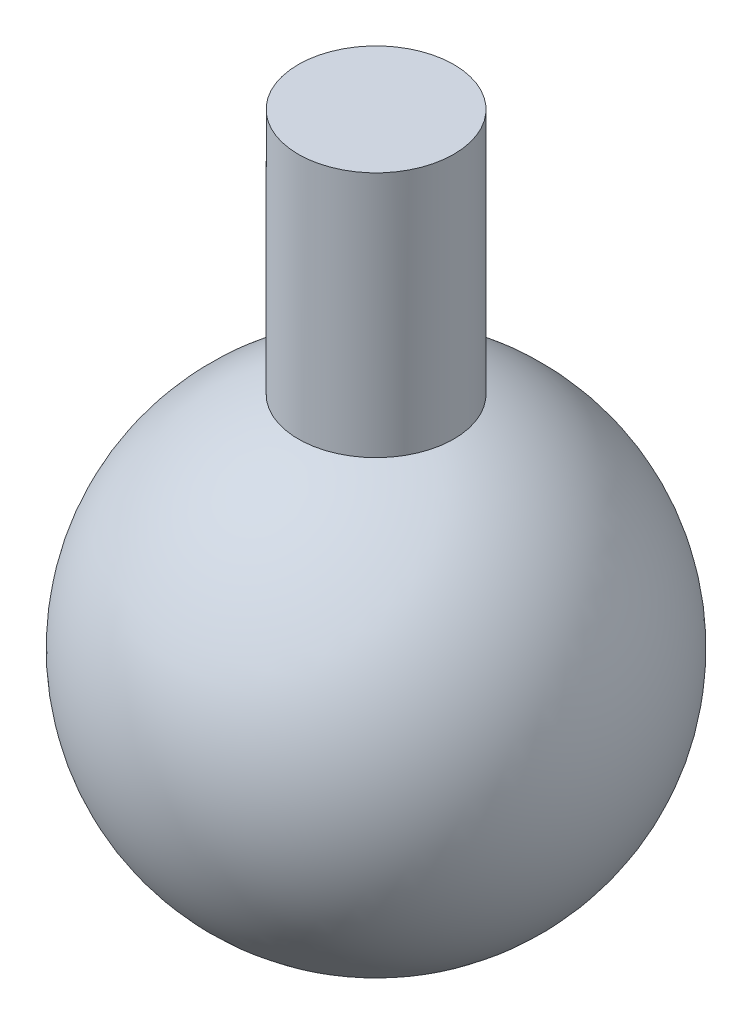
ISO-10303-21;
HEADER;
FILE_DESCRIPTION(('STEP AP214'),'2;1');
FILE_NAME('part.step','',(''),(''),'','','');
FILE_SCHEMA(('AUTOMOTIVE_DESIGN { 1 0 10303 214 1 1 1 1 }'));
ENDSEC;
DATA;
#1=APPLICATION_CONTEXT('core data for automotive mechanical design processes');
#2=APPLICATION_PROTOCOL_DEFINITION('international standard','automotive_design',2000,#1);
#3=PRODUCT_CONTEXT('',#1,'mechanical');
#4=PRODUCT('Part','Part','',(#3));
#5=PRODUCT_RELATED_PRODUCT_CATEGORY('part','',(#4));
#6=PRODUCT_DEFINITION_FORMATION('','',#4);
#7=PRODUCT_DEFINITION_CONTEXT('part definition',#1,'design');
#8=PRODUCT_DEFINITION('design','',#6,#7);
#9=PRODUCT_DEFINITION_SHAPE('','',#8);
#10=(LENGTH_UNIT() NAMED_UNIT(*) SI_UNIT(.MILLI.,.METRE.));
#11=(NAMED_UNIT(*) PLANE_ANGLE_UNIT() SI_UNIT($,.RADIAN.));
#12=(NAMED_UNIT(*) SI_UNIT($,.STERADIAN.) SOLID_ANGLE_UNIT());
#13=UNCERTAINTY_MEASURE_WITH_UNIT(LENGTH_MEASURE(1.E-05),#10,'distance_accuracy_value','');
#14=(GEOMETRIC_REPRESENTATION_CONTEXT(3) GLOBAL_UNCERTAINTY_ASSIGNED_CONTEXT((#13)) GLOBAL_UNIT_ASSIGNED_CONTEXT((#10,
#11,#12)) REPRESENTATION_CONTEXT('',''));
#15=CARTESIAN_POINT('',(0.,0.,0.));
#16=DIRECTION('',(0.,0.,1.));
#17=DIRECTION('',(1.,0.,0.));
#18=AXIS2_PLACEMENT_3D('',#15,#16,#17);
#19=CARTESIAN_POINT('',(0.,0.,0.));
#20=DIRECTION('',(0.,0.,-1.));
#21=DIRECTION('',(1.,0.,0.));
#22=AXIS2_PLACEMENT_3D('',#19,#20,#21);
#23=SPHERICAL_SURFACE('',#22,3.);
#24=CARTESIAN_POINT('',(0.,0.,0.));
#25=DIRECTION('',(0.,-1.,0.));
#26=DIRECTION('',(0.,0.,-1.));
#27=AXIS2_PLACEMENT_3D('',#24,#25,#26);
#28=SPHERICAL_SURFACE('',#27,3.);
#29=CARTESIAN_POINT('',(0.,2.82842712474619,0.));
#30=DIRECTION('',(0.,-1.,0.));
#31=DIRECTION('',(0.,0.,-1.));
#32=AXIS2_PLACEMENT_3D('',#29,#30,#31);
#33=CIRCLE('',#32,1.);
#34=CARTESIAN_POINT('',(0.,2.82842712474619,-1.));
#35=VERTEX_POINT('',#34);
#36=EDGE_CURVE('E10',#35,#35,#33,.F.);
#37=ORIENTED_EDGE('',*,*,#36,.F.);
#38=EDGE_LOOP('',(#37));
#39=FACE_BOUND('',#38,.T.);
#40=ADVANCED_FACE('F32',(#39),#28,.T.);
#41=CARTESIAN_POINT('',(0.,6.,0.));
#42=DIRECTION('',(0.,-1.,0.));
#43=DIRECTION('',(0.,0.,-1.));
#44=AXIS2_PLACEMENT_3D('',#41,#42,#43);
#45=CYLINDRICAL_SURFACE('',#44,1.);
#46=CARTESIAN_POINT('',(0.,6.,0.));
#47=DIRECTION('',(0.,1.,0.));
#48=DIRECTION('',(0.,0.,1.));
#49=AXIS2_PLACEMENT_3D('',#46,#47,#48);
#50=CIRCLE('',#49,1.);
#51=CARTESIAN_POINT('',(0.,6.,1.));
#52=VERTEX_POINT('',#51);
#53=EDGE_CURVE('E38',#52,#52,#50,.T.);
#54=ORIENTED_EDGE('',*,*,#53,.F.);
#55=EDGE_LOOP('',(#54));
#56=FACE_BOUND('',#55,.T.);
#57=ORIENTED_EDGE('',*,*,#36,.T.);
#58=EDGE_LOOP('',(#57));
#59=FACE_BOUND('',#58,.T.);
#60=ADVANCED_FACE('F46',(#56,#59),#45,.T.);
#61=CARTESIAN_POINT('',(0.,6.,0.));
#62=DIRECTION('',(0.,1.,0.));
#63=DIRECTION('',(0.,0.,1.));
#64=AXIS2_PLACEMENT_3D('',#61,#62,#63);
#65=PLANE('',#64);
#66=ORIENTED_EDGE('',*,*,#53,.T.);
#67=EDGE_LOOP('',(#66));
#68=FACE_BOUND('',#67,.T.);
#69=ADVANCED_FACE('F44',(#68),#65,.T.);
#70=CLOSED_SHELL('',(#40,#60,#69));
#71=MANIFOLD_SOLID_BREP('B2',#70);
#72=ADVANCED_BREP_SHAPE_REPRESENTATION('',(#18,#71),#14);
#73=SHAPE_DEFINITION_REPRESENTATION(#9,#72);
ENDSEC;
END-ISO-10303-21;
